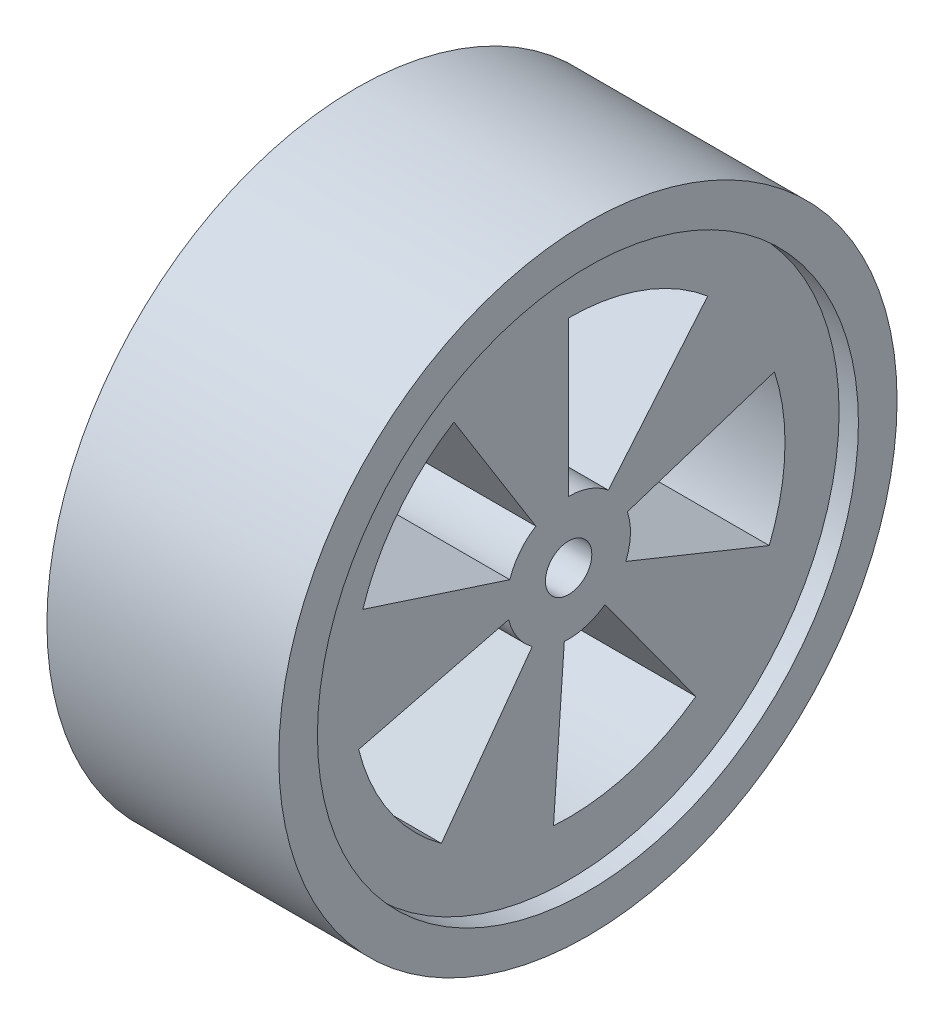
ISO-10303-21;
HEADER;
FILE_DESCRIPTION(('STEP AP214'),'2;1');
FILE_NAME('part.step','',(''),(''),'','','');
FILE_SCHEMA(('AUTOMOTIVE_DESIGN { 1 0 10303 214 1 1 1 1 }'));
ENDSEC;
DATA;
#1=APPLICATION_CONTEXT('core data for automotive mechanical design processes');
#2=APPLICATION_PROTOCOL_DEFINITION('international standard','automotive_design',2000,#1);
#3=PRODUCT_CONTEXT('',#1,'mechanical');
#4=PRODUCT('Part','Part','',(#3));
#5=PRODUCT_RELATED_PRODUCT_CATEGORY('part','',(#4));
#6=PRODUCT_DEFINITION_FORMATION('','',#4);
#7=PRODUCT_DEFINITION_CONTEXT('part definition',#1,'design');
#8=PRODUCT_DEFINITION('design','',#6,#7);
#9=PRODUCT_DEFINITION_SHAPE('','',#8);
#10=(LENGTH_UNIT() NAMED_UNIT(*) SI_UNIT(.MILLI.,.METRE.));
#11=(NAMED_UNIT(*) PLANE_ANGLE_UNIT() SI_UNIT($,.RADIAN.));
#12=(NAMED_UNIT(*) SI_UNIT($,.STERADIAN.) SOLID_ANGLE_UNIT());
#13=UNCERTAINTY_MEASURE_WITH_UNIT(LENGTH_MEASURE(1.E-05),#10,'distance_accuracy_value','');
#14=(GEOMETRIC_REPRESENTATION_CONTEXT(3) GLOBAL_UNCERTAINTY_ASSIGNED_CONTEXT((#13)) GLOBAL_UNIT_ASSIGNED_CONTEXT((#10,
#11,#12)) REPRESENTATION_CONTEXT('',''));
#15=CARTESIAN_POINT('',(0.,0.,0.));
#16=DIRECTION('',(0.,0.,1.));
#17=DIRECTION('',(1.,0.,0.));
#18=AXIS2_PLACEMENT_3D('',#15,#16,#17);
#19=CARTESIAN_POINT('',(12.5,0.,0.));
#20=DIRECTION('',(1.,0.,0.));
#21=DIRECTION('',(0.,0.,-1.));
#22=AXIS2_PLACEMENT_3D('',#19,#20,#21);
#23=PLANE('',#22);
#24=CARTESIAN_POINT('',(12.5,0.,0.));
#25=DIRECTION('',(1.,0.,0.));
#26=DIRECTION('',(0.,0.,-1.));
#27=AXIS2_PLACEMENT_3D('',#24,#25,#26);
#28=CIRCLE('',#27,35.);
#29=CARTESIAN_POINT('',(12.5,0.,-35.));
#30=VERTEX_POINT('',#29);
#31=EDGE_CURVE('E210',#30,#30,#28,.F.);
#32=ORIENTED_EDGE('',*,*,#31,.F.);
#33=EDGE_LOOP('',(#32));
#34=FACE_BOUND('',#33,.T.);
#35=CARTESIAN_POINT('',(12.5,0.,0.));
#36=DIRECTION('',(1.,0.,0.));
#37=DIRECTION('',(0.,0.,-1.));
#38=AXIS2_PLACEMENT_3D('',#35,#36,#37);
#39=CIRCLE('',#38,3.);
#40=CARTESIAN_POINT('',(12.5,0.,-3.));
#41=VERTEX_POINT('',#40);
#42=EDGE_CURVE('E53',#41,#41,#39,.T.);
#43=ORIENTED_EDGE('',*,*,#42,.F.);
#44=EDGE_LOOP('',(#43));
#45=FACE_BOUND('',#44,.T.);
#46=DIRECTION('',(0.,-1.,0.));
#47=VECTOR('',#46,1.);
#48=CARTESIAN_POINT('',(12.5,28.,0.));
#49=LINE('',#48,#47);
#50=CARTESIAN_POINT('',(12.5,28.,0.));
#51=VERTEX_POINT('',#50);
#52=CARTESIAN_POINT('',(12.5,8.,0.));
#53=VERTEX_POINT('',#52);
#54=EDGE_CURVE('E315',#51,#53,#49,.T.);
#55=ORIENTED_EDGE('',*,*,#54,.F.);
#56=CARTESIAN_POINT('',(12.5,0.,0.));
#57=DIRECTION('',(1.,0.,0.));
#58=DIRECTION('',(0.,0.,-1.));
#59=AXIS2_PLACEMENT_3D('',#56,#57,#58);
#60=CIRCLE('',#59,28.);
#61=CARTESIAN_POINT('',(12.5,21.4492444073315,-17.998053071223));
#62=VERTEX_POINT('',#61);
#63=EDGE_CURVE('E313',#62,#51,#60,.T.);
#64=ORIENTED_EDGE('',*,*,#63,.F.);
#65=DIRECTION('',(0.,0.766044443118982,-0.642787609686535));
#66=VECTOR('',#65,1.);
#67=CARTESIAN_POINT('',(12.5,6.12835554495186,-5.14230087749228));
#68=LINE('',#67,#66);
#69=CARTESIAN_POINT('',(12.5,6.12835554495186,-5.14230087749228));
#70=VERTEX_POINT('',#69);
#71=EDGE_CURVE('E321',#70,#62,#68,.T.);
#72=ORIENTED_EDGE('',*,*,#71,.F.);
#73=CARTESIAN_POINT('',(12.5,0.,0.));
#74=DIRECTION('',(-1.,0.,0.));
#75=DIRECTION('',(0.,0.,-1.));
#76=AXIS2_PLACEMENT_3D('',#73,#74,#75);
#77=CIRCLE('',#76,8.);
#78=EDGE_CURVE('E318',#53,#70,#77,.T.);
#79=ORIENTED_EDGE('',*,*,#78,.F.);
#80=EDGE_LOOP('',(#55,#64,#72,#79));
#81=FACE_BOUND('',#80,.T.);
#82=DIRECTION('',(0.,-0.309016994374945,0.951056516295154));
#83=VECTOR('',#82,1.);
#84=CARTESIAN_POINT('',(12.5,8.65247584249845,-26.6295824562643));
#85=LINE('',#84,#83);
#86=CARTESIAN_POINT('',(12.5,8.65247584249845,-26.6295824562643));
#87=VERTEX_POINT('',#86);
#88=CARTESIAN_POINT('',(12.5,2.47213595499956,-7.60845213036124));
#89=VERTEX_POINT('',#88);
#90=EDGE_CURVE('E284',#87,#89,#85,.T.);
#91=ORIENTED_EDGE('',*,*,#90,.F.);
#92=CARTESIAN_POINT('',(12.5,0.,0.));
#93=DIRECTION('',(1.,0.,0.));
#94=DIRECTION('',(0.,0.,-1.));
#95=AXIS2_PLACEMENT_3D('',#92,#93,#94);
#96=CIRCLE('',#95,28.);
#97=CARTESIAN_POINT('',(12.5,-10.4889846156455,-25.9611479278701));
#98=VERTEX_POINT('',#97);
#99=EDGE_CURVE('E282',#98,#87,#96,.T.);
#100=ORIENTED_EDGE('',*,*,#99,.F.);
#101=DIRECTION('',(0.,-0.374606593415909,-0.927183854566789));
#102=VECTOR('',#101,1.);
#103=CARTESIAN_POINT('',(12.5,-2.99685274732727,-7.41747083653431));
#104=LINE('',#103,#102);
#105=CARTESIAN_POINT('',(12.5,-2.99685274732727,-7.41747083653431));
#106=VERTEX_POINT('',#105);
#107=EDGE_CURVE('E290',#106,#98,#104,.T.);
#108=ORIENTED_EDGE('',*,*,#107,.F.);
#109=CARTESIAN_POINT('',(12.5,0.,0.));
#110=DIRECTION('',(-1.,0.,0.));
#111=DIRECTION('',(0.,0.,-1.));
#112=AXIS2_PLACEMENT_3D('',#109,#110,#111);
#113=CIRCLE('',#112,8.);
#114=EDGE_CURVE('E287',#89,#106,#113,.T.);
#115=ORIENTED_EDGE('',*,*,#114,.F.);
#116=EDGE_LOOP('',(#91,#100,#108,#115));
#117=FACE_BOUND('',#116,.T.);
#118=DIRECTION('',(0.,0.809016994374951,0.587785252292469));
#119=VECTOR('',#118,1.);
#120=CARTESIAN_POINT('',(12.5,-22.6524758424986,-16.4579870641891));
#121=LINE('',#120,#119);
#122=CARTESIAN_POINT('',(12.5,-22.6524758424986,-16.4579870641891));
#123=VERTEX_POINT('',#122);
#124=CARTESIAN_POINT('',(12.5,-6.47213595499961,-4.70228201833975));
#125=VERTEX_POINT('',#124);
#126=EDGE_CURVE('E253',#123,#125,#121,.T.);
#127=ORIENTED_EDGE('',*,*,#126,.F.);
#128=CARTESIAN_POINT('',(12.5,0.,0.));
#129=DIRECTION('',(1.,0.,0.));
#130=DIRECTION('',(0.,0.,-1.));
#131=AXIS2_PLACEMENT_3D('',#128,#129,#130);
#132=CIRCLE('',#131,28.);
#133=CARTESIAN_POINT('',(12.5,-27.9317934072751,1.9531812648355));
#134=VERTEX_POINT('',#133);
#135=EDGE_CURVE('E251',#134,#123,#132,.T.);
#136=ORIENTED_EDGE('',*,*,#135,.F.);
#137=DIRECTION('',(0.,-0.997564050259824,0.0697564737441249));
#138=VECTOR('',#137,1.);
#139=CARTESIAN_POINT('',(12.5,-7.9805124020786,0.558051789952999));
#140=LINE('',#139,#138);
#141=CARTESIAN_POINT('',(12.5,-7.9805124020786,0.558051789952999));
#142=VERTEX_POINT('',#141);
#143=EDGE_CURVE('E259',#142,#134,#140,.T.);
#144=ORIENTED_EDGE('',*,*,#143,.F.);
#145=CARTESIAN_POINT('',(12.5,0.,0.));
#146=DIRECTION('',(-1.,0.,0.));
#147=DIRECTION('',(0.,0.,-1.));
#148=AXIS2_PLACEMENT_3D('',#145,#146,#147);
#149=CIRCLE('',#148,8.);
#150=EDGE_CURVE('E256',#125,#142,#149,.T.);
#151=ORIENTED_EDGE('',*,*,#150,.F.);
#152=EDGE_LOOP('',(#127,#136,#144,#151));
#153=FACE_BOUND('',#152,.T.);
#154=DIRECTION('',(0.,0.809016994374942,-0.58778525229248));
#155=VECTOR('',#154,1.);
#156=CARTESIAN_POINT('',(12.5,-22.6524758424984,16.4579870641894));
#157=LINE('',#156,#155);
#158=CARTESIAN_POINT('',(12.5,-22.6524758424984,16.4579870641894));
#159=VERTEX_POINT('',#158);
#160=CARTESIAN_POINT('',(12.5,-6.47213595499954,4.70228201833984));
#161=VERTEX_POINT('',#160);
#162=EDGE_CURVE('E222',#159,#161,#157,.T.);
#163=ORIENTED_EDGE('',*,*,#162,.F.);
#164=CARTESIAN_POINT('',(12.5,0.,0.));
#165=DIRECTION('',(1.,0.,0.));
#166=DIRECTION('',(0.,0.,-1.));
#167=AXIS2_PLACEMENT_3D('',#164,#165,#166);
#168=CIRCLE('',#167,28.);
#169=CARTESIAN_POINT('',(12.5,-6.77381307679062,27.1682803357279));
#170=VERTEX_POINT('',#169);
#171=EDGE_CURVE('E220',#170,#159,#168,.T.);
#172=ORIENTED_EDGE('',*,*,#171,.F.);
#173=DIRECTION('',(0.,-0.241921895599665,0.970295726275997));
#174=VECTOR('',#173,1.);
#175=CARTESIAN_POINT('',(12.5,-1.93537516479732,7.76236581020798));
#176=LINE('',#175,#174);
#177=CARTESIAN_POINT('',(12.5,-1.93537516479732,7.76236581020798));
#178=VERTEX_POINT('',#177);
#179=EDGE_CURVE('E228',#178,#170,#176,.T.);
#180=ORIENTED_EDGE('',*,*,#179,.F.);
#181=CARTESIAN_POINT('',(12.5,0.,0.));
#182=DIRECTION('',(-1.,0.,0.));
#183=DIRECTION('',(0.,0.,-1.));
#184=AXIS2_PLACEMENT_3D('',#181,#182,#183);
#185=CIRCLE('',#184,8.);
#186=EDGE_CURVE('E225',#161,#178,#185,.T.);
#187=ORIENTED_EDGE('',*,*,#186,.F.);
#188=EDGE_LOOP('',(#163,#172,#180,#187));
#189=FACE_BOUND('',#188,.T.);
#190=DIRECTION('',(0.,-0.309016994374958,-0.95105651629515));
#191=VECTOR('',#190,1.);
#192=CARTESIAN_POINT('',(12.5,8.65247584249883,26.6295824562642));
#193=LINE('',#192,#191);
#194=CARTESIAN_POINT('',(12.5,8.65247584249883,26.6295824562642));
#195=VERTEX_POINT('',#194);
#196=CARTESIAN_POINT('',(12.5,2.47213595499967,7.6084521303612));
#197=VERTEX_POINT('',#196);
#198=EDGE_CURVE('E190',#195,#197,#193,.T.);
#199=ORIENTED_EDGE('',*,*,#198,.F.);
#200=CARTESIAN_POINT('',(12.5,0.,0.));
#201=DIRECTION('',(1.,0.,0.));
#202=DIRECTION('',(0.,0.,-1.));
#203=AXIS2_PLACEMENT_3D('',#200,#201,#202);
#204=CIRCLE('',#203,28.);
#205=CARTESIAN_POINT('',(12.5,23.74534669238,14.8377393985296));
#206=VERTEX_POINT('',#205);
#207=EDGE_CURVE('E182',#206,#195,#204,.T.);
#208=ORIENTED_EDGE('',*,*,#207,.F.);
#209=DIRECTION('',(0.,0.848048096156429,0.5299192642332));
#210=VECTOR('',#209,1.);
#211=CARTESIAN_POINT('',(12.5,6.78438476925143,4.23935411386561));
#212=LINE('',#211,#210);
#213=CARTESIAN_POINT('',(12.5,6.78438476925143,4.2393541138656));
#214=VERTEX_POINT('',#213);
#215=EDGE_CURVE('E204',#214,#206,#212,.T.);
#216=ORIENTED_EDGE('',*,*,#215,.F.);
#217=CARTESIAN_POINT('',(12.5,0.,0.));
#218=DIRECTION('',(-1.,0.,0.));
#219=DIRECTION('',(0.,0.,-1.));
#220=AXIS2_PLACEMENT_3D('',#217,#218,#219);
#221=CIRCLE('',#220,8.);
#222=EDGE_CURVE('E202',#197,#214,#221,.T.);
#223=ORIENTED_EDGE('',*,*,#222,.F.);
#224=EDGE_LOOP('',(#199,#208,#216,#223));
#225=FACE_BOUND('',#224,.T.);
#226=ADVANCED_FACE('F45',(#34,#45,#81,#117,#153,#189,#225),#23,.T.);
#227=CARTESIAN_POINT('',(-12.5,0.,0.));
#228=DIRECTION('',(1.,0.,0.));
#229=DIRECTION('',(0.,0.,-1.));
#230=AXIS2_PLACEMENT_3D('',#227,#228,#229);
#231=PLANE('',#230);
#232=CARTESIAN_POINT('',(-12.5,0.,0.));
#233=DIRECTION('',(1.,0.,0.));
#234=DIRECTION('',(0.,0.,-1.));
#235=AXIS2_PLACEMENT_3D('',#232,#233,#234);
#236=CIRCLE('',#235,28.);
#237=CARTESIAN_POINT('',(-12.5,-6.77381307679062,27.1682803357279));
#238=VERTEX_POINT('',#237);
#239=CARTESIAN_POINT('',(-12.5,-22.6524758424984,16.4579870641894));
#240=VERTEX_POINT('',#239);
#241=EDGE_CURVE('E198',#238,#240,#236,.T.);
#242=ORIENTED_EDGE('',*,*,#241,.T.);
#243=DIRECTION('',(0.,0.809016994374942,-0.58778525229248));
#244=VECTOR('',#243,1.);
#245=CARTESIAN_POINT('',(-12.5,-22.6524758424984,16.4579870641894));
#246=LINE('',#245,#244);
#247=CARTESIAN_POINT('',(-12.5,-6.47213595499954,4.70228201833984));
#248=VERTEX_POINT('',#247);
#249=EDGE_CURVE('E233',#240,#248,#246,.T.);
#250=ORIENTED_EDGE('',*,*,#249,.T.);
#251=CARTESIAN_POINT('',(-12.5,0.,0.));
#252=DIRECTION('',(-1.,0.,0.));
#253=DIRECTION('',(0.,0.,-1.));
#254=AXIS2_PLACEMENT_3D('',#251,#252,#253);
#255=CIRCLE('',#254,8.);
#256=CARTESIAN_POINT('',(-12.5,-1.93537516479732,7.76236581020798));
#257=VERTEX_POINT('',#256);
#258=EDGE_CURVE('E236',#248,#257,#255,.T.);
#259=ORIENTED_EDGE('',*,*,#258,.T.);
#260=DIRECTION('',(0.,-0.241921895599665,0.970295726275997));
#261=VECTOR('',#260,1.);
#262=CARTESIAN_POINT('',(-12.5,-1.93537516479732,7.76236581020798));
#263=LINE('',#262,#261);
#264=EDGE_CURVE('E223',#257,#238,#263,.T.);
#265=ORIENTED_EDGE('',*,*,#264,.T.);
#266=EDGE_LOOP('',(#242,#250,#259,#265));
#267=FACE_BOUND('',#266,.T.);
#268=CARTESIAN_POINT('',(-12.5,0.,0.));
#269=DIRECTION('',(1.,0.,0.));
#270=DIRECTION('',(0.,0.,-1.));
#271=AXIS2_PLACEMENT_3D('',#268,#269,#270);
#272=CIRCLE('',#271,28.);
#273=CARTESIAN_POINT('',(-12.5,-10.4889846156455,-25.9611479278701));
#274=VERTEX_POINT('',#273);
#275=CARTESIAN_POINT('',(-12.5,8.65247584249845,-26.6295824562643));
#276=VERTEX_POINT('',#275);
#277=EDGE_CURVE('E281',#274,#276,#272,.T.);
#278=ORIENTED_EDGE('',*,*,#277,.T.);
#279=DIRECTION('',(0.,-0.309016994374945,0.951056516295154));
#280=VECTOR('',#279,1.);
#281=CARTESIAN_POINT('',(-12.5,8.65247584249845,-26.6295824562643));
#282=LINE('',#281,#280);
#283=CARTESIAN_POINT('',(-12.5,2.47213595499956,-7.60845213036124));
#284=VERTEX_POINT('',#283);
#285=EDGE_CURVE('E295',#276,#284,#282,.T.);
#286=ORIENTED_EDGE('',*,*,#285,.T.);
#287=CARTESIAN_POINT('',(-12.5,0.,0.));
#288=DIRECTION('',(-1.,0.,0.));
#289=DIRECTION('',(0.,0.,-1.));
#290=AXIS2_PLACEMENT_3D('',#287,#288,#289);
#291=CIRCLE('',#290,8.);
#292=CARTESIAN_POINT('',(-12.5,-2.99685274732727,-7.41747083653431));
#293=VERTEX_POINT('',#292);
#294=EDGE_CURVE('E298',#284,#293,#291,.T.);
#295=ORIENTED_EDGE('',*,*,#294,.T.);
#296=DIRECTION('',(0.,-0.374606593415909,-0.927183854566789));
#297=VECTOR('',#296,1.);
#298=CARTESIAN_POINT('',(-12.5,-2.99685274732727,-7.41747083653431));
#299=LINE('',#298,#297);
#300=EDGE_CURVE('E285',#293,#274,#299,.T.);
#301=ORIENTED_EDGE('',*,*,#300,.T.);
#302=EDGE_LOOP('',(#278,#286,#295,#301));
#303=FACE_BOUND('',#302,.T.);
#304=CARTESIAN_POINT('',(-12.5,0.,0.));
#305=DIRECTION('',(1.,0.,0.));
#306=DIRECTION('',(0.,0.,-1.));
#307=AXIS2_PLACEMENT_3D('',#304,#305,#306);
#308=CIRCLE('',#307,3.);
#309=CARTESIAN_POINT('',(-12.5,0.,-3.));
#310=VERTEX_POINT('',#309);
#311=EDGE_CURVE('E343',#310,#310,#308,.T.);
#312=ORIENTED_EDGE('',*,*,#311,.T.);
#313=EDGE_LOOP('',(#312));
#314=FACE_BOUND('',#313,.T.);
#315=CARTESIAN_POINT('',(-12.5,0.,0.));
#316=DIRECTION('',(1.,0.,0.));
#317=DIRECTION('',(0.,0.,-1.));
#318=AXIS2_PLACEMENT_3D('',#315,#316,#317);
#319=CIRCLE('',#318,35.);
#320=CARTESIAN_POINT('',(-12.5,0.,-35.));
#321=VERTEX_POINT('',#320);
#322=EDGE_CURVE('E11',#321,#321,#319,.T.);
#323=ORIENTED_EDGE('',*,*,#322,.F.);
#324=EDGE_LOOP('',(#323));
#325=FACE_BOUND('',#324,.T.);
#326=CARTESIAN_POINT('',(-12.5,0.,0.));
#327=DIRECTION('',(1.,0.,0.));
#328=DIRECTION('',(0.,0.,-1.));
#329=AXIS2_PLACEMENT_3D('',#326,#327,#328);
#330=CIRCLE('',#329,28.);
#331=CARTESIAN_POINT('',(-12.5,21.4492444073315,-17.998053071223));
#332=VERTEX_POINT('',#331);
#333=CARTESIAN_POINT('',(-12.5,28.,0.));
#334=VERTEX_POINT('',#333);
#335=EDGE_CURVE('E312',#332,#334,#330,.T.);
#336=ORIENTED_EDGE('',*,*,#335,.T.);
#337=DIRECTION('',(0.,-1.,0.));
#338=VECTOR('',#337,1.);
#339=CARTESIAN_POINT('',(-12.5,28.,0.));
#340=LINE('',#339,#338);
#341=CARTESIAN_POINT('',(-12.5,8.,0.));
#342=VERTEX_POINT('',#341);
#343=EDGE_CURVE('E326',#334,#342,#340,.T.);
#344=ORIENTED_EDGE('',*,*,#343,.T.);
#345=CARTESIAN_POINT('',(-12.5,0.,0.));
#346=DIRECTION('',(-1.,0.,0.));
#347=DIRECTION('',(0.,0.,-1.));
#348=AXIS2_PLACEMENT_3D('',#345,#346,#347);
#349=CIRCLE('',#348,8.);
#350=CARTESIAN_POINT('',(-12.5,6.12835554495186,-5.14230087749228));
#351=VERTEX_POINT('',#350);
#352=EDGE_CURVE('E329',#342,#351,#349,.T.);
#353=ORIENTED_EDGE('',*,*,#352,.T.);
#354=DIRECTION('',(0.,0.766044443118982,-0.642787609686535));
#355=VECTOR('',#354,1.);
#356=CARTESIAN_POINT('',(-12.5,6.12835554495186,-5.14230087749228));
#357=LINE('',#356,#355);
#358=EDGE_CURVE('E316',#351,#332,#357,.T.);
#359=ORIENTED_EDGE('',*,*,#358,.T.);
#360=EDGE_LOOP('',(#336,#344,#353,#359));
#361=FACE_BOUND('',#360,.T.);
#362=CARTESIAN_POINT('',(-12.5,0.,0.));
#363=DIRECTION('',(1.,0.,0.));
#364=DIRECTION('',(0.,0.,-1.));
#365=AXIS2_PLACEMENT_3D('',#362,#363,#364);
#366=CIRCLE('',#365,28.);
#367=CARTESIAN_POINT('',(-12.5,-27.9317934072751,1.9531812648355));
#368=VERTEX_POINT('',#367);
#369=CARTESIAN_POINT('',(-12.5,-22.6524758424986,-16.4579870641891));
#370=VERTEX_POINT('',#369);
#371=EDGE_CURVE('E250',#368,#370,#366,.T.);
#372=ORIENTED_EDGE('',*,*,#371,.T.);
#373=DIRECTION('',(0.,0.809016994374951,0.587785252292469));
#374=VECTOR('',#373,1.);
#375=CARTESIAN_POINT('',(-12.5,-22.6524758424986,-16.4579870641891));
#376=LINE('',#375,#374);
#377=CARTESIAN_POINT('',(-12.5,-6.47213595499961,-4.70228201833975));
#378=VERTEX_POINT('',#377);
#379=EDGE_CURVE('E264',#370,#378,#376,.T.);
#380=ORIENTED_EDGE('',*,*,#379,.T.);
#381=CARTESIAN_POINT('',(-12.5,0.,0.));
#382=DIRECTION('',(-1.,0.,0.));
#383=DIRECTION('',(0.,0.,-1.));
#384=AXIS2_PLACEMENT_3D('',#381,#382,#383);
#385=CIRCLE('',#384,8.);
#386=CARTESIAN_POINT('',(-12.5,-7.9805124020786,0.558051789952998));
#387=VERTEX_POINT('',#386);
#388=EDGE_CURVE('E267',#378,#387,#385,.T.);
#389=ORIENTED_EDGE('',*,*,#388,.T.);
#390=DIRECTION('',(0.,-0.997564050259824,0.0697564737441249));
#391=VECTOR('',#390,1.);
#392=CARTESIAN_POINT('',(-12.5,-7.9805124020786,0.558051789952999));
#393=LINE('',#392,#391);
#394=EDGE_CURVE('E254',#387,#368,#393,.T.);
#395=ORIENTED_EDGE('',*,*,#394,.T.);
#396=EDGE_LOOP('',(#372,#380,#389,#395));
#397=FACE_BOUND('',#396,.T.);
#398=CARTESIAN_POINT('',(-12.5,0.,0.));
#399=DIRECTION('',(1.,0.,0.));
#400=DIRECTION('',(0.,0.,-1.));
#401=AXIS2_PLACEMENT_3D('',#398,#399,#400);
#402=CIRCLE('',#401,28.);
#403=CARTESIAN_POINT('',(-12.5,23.74534669238,14.8377393985296));
#404=VERTEX_POINT('',#403);
#405=CARTESIAN_POINT('',(-12.5,8.65247584249883,26.6295824562642));
#406=VERTEX_POINT('',#405);
#407=EDGE_CURVE('E68',#404,#406,#402,.T.);
#408=ORIENTED_EDGE('',*,*,#407,.T.);
#409=DIRECTION('',(0.,-0.309016994374958,-0.95105651629515));
#410=VECTOR('',#409,1.);
#411=CARTESIAN_POINT('',(-12.5,8.65247584249883,26.6295824562642));
#412=LINE('',#411,#410);
#413=CARTESIAN_POINT('',(-12.5,2.47213595499967,7.6084521303612));
#414=VERTEX_POINT('',#413);
#415=EDGE_CURVE('E197',#406,#414,#412,.T.);
#416=ORIENTED_EDGE('',*,*,#415,.T.);
#417=CARTESIAN_POINT('',(-12.5,0.,0.));
#418=DIRECTION('',(-1.,0.,0.));
#419=DIRECTION('',(0.,0.,-1.));
#420=AXIS2_PLACEMENT_3D('',#417,#418,#419);
#421=CIRCLE('',#420,8.);
#422=CARTESIAN_POINT('',(-12.5,6.78438476925143,4.23935411386561));
#423=VERTEX_POINT('',#422);
#424=EDGE_CURVE('E212',#414,#423,#421,.T.);
#425=ORIENTED_EDGE('',*,*,#424,.T.);
#426=DIRECTION('',(0.,0.848048096156429,0.5299192642332));
#427=VECTOR('',#426,1.);
#428=CARTESIAN_POINT('',(-12.5,6.78438476925143,4.23935411386561));
#429=LINE('',#428,#427);
#430=EDGE_CURVE('E191',#423,#404,#429,.T.);
#431=ORIENTED_EDGE('',*,*,#430,.T.);
#432=EDGE_LOOP('',(#408,#416,#425,#431));
#433=FACE_BOUND('',#432,.T.);
#434=ADVANCED_FACE('F47',(#267,#303,#314,#325,#361,#397,#433),#231,.F.);
#435=CARTESIAN_POINT('',(12.5,0.,0.));
#436=DIRECTION('',(-1.,0.,0.));
#437=DIRECTION('',(0.,0.,1.));
#438=AXIS2_PLACEMENT_3D('',#435,#436,#437);
#439=CYLINDRICAL_SURFACE('',#438,3.);
#440=ORIENTED_EDGE('',*,*,#42,.T.);
#441=EDGE_LOOP('',(#440));
#442=FACE_BOUND('',#441,.T.);
#443=ORIENTED_EDGE('',*,*,#311,.F.);
#444=EDGE_LOOP('',(#443));
#445=FACE_BOUND('',#444,.T.);
#446=ADVANCED_FACE('F350',(#442,#445),#439,.F.);
#447=CARTESIAN_POINT('',(12.5,0.,0.));
#448=DIRECTION('',(-1.,0.,0.));
#449=DIRECTION('',(0.,0.,1.));
#450=AXIS2_PLACEMENT_3D('',#447,#448,#449);
#451=CYLINDRICAL_SURFACE('',#450,28.);
#452=ORIENTED_EDGE('',*,*,#335,.F.);
#453=DIRECTION('',(-1.,0.,0.));
#454=VECTOR('',#453,1.);
#455=CARTESIAN_POINT('',(12.5,21.4492444073315,-17.998053071223));
#456=LINE('',#455,#454);
#457=EDGE_CURVE('E323',#62,#332,#456,.T.);
#458=ORIENTED_EDGE('',*,*,#457,.F.);
#459=ORIENTED_EDGE('',*,*,#63,.T.);
#460=DIRECTION('',(-1.,0.,0.));
#461=VECTOR('',#460,1.);
#462=CARTESIAN_POINT('',(12.5,28.,0.));
#463=LINE('',#462,#461);
#464=EDGE_CURVE('E340',#51,#334,#463,.T.);
#465=ORIENTED_EDGE('',*,*,#464,.T.);
#466=EDGE_LOOP('',(#452,#458,#459,#465));
#467=FACE_BOUND('',#466,.T.);
#468=ADVANCED_FACE('F352',(#467),#451,.F.);
#469=CARTESIAN_POINT('',(12.5,28.,0.));
#470=DIRECTION('',(0.,0.,-1.));
#471=DIRECTION('',(0.,1.,0.));
#472=AXIS2_PLACEMENT_3D('',#469,#470,#471);
#473=PLANE('',#472);
#474=ORIENTED_EDGE('',*,*,#343,.F.);
#475=ORIENTED_EDGE('',*,*,#464,.F.);
#476=ORIENTED_EDGE('',*,*,#54,.T.);
#477=DIRECTION('',(-1.,0.,0.));
#478=VECTOR('',#477,1.);
#479=CARTESIAN_POINT('',(12.5,8.,0.));
#480=LINE('',#479,#478);
#481=EDGE_CURVE('E338',#53,#342,#480,.T.);
#482=ORIENTED_EDGE('',*,*,#481,.T.);
#483=EDGE_LOOP('',(#474,#475,#476,#482));
#484=FACE_BOUND('',#483,.T.);
#485=ADVANCED_FACE('F359',(#484),#473,.T.);
#486=CARTESIAN_POINT('',(12.5,0.,0.));
#487=DIRECTION('',(-1.,0.,0.));
#488=DIRECTION('',(0.,0.,1.));
#489=AXIS2_PLACEMENT_3D('',#486,#487,#488);
#490=CYLINDRICAL_SURFACE('',#489,8.);
#491=ORIENTED_EDGE('',*,*,#352,.F.);
#492=ORIENTED_EDGE('',*,*,#481,.F.);
#493=ORIENTED_EDGE('',*,*,#78,.T.);
#494=DIRECTION('',(-1.,0.,0.));
#495=VECTOR('',#494,1.);
#496=CARTESIAN_POINT('',(12.5,6.12835554495186,-5.14230087749228));
#497=LINE('',#496,#495);
#498=EDGE_CURVE('E336',#70,#351,#497,.T.);
#499=ORIENTED_EDGE('',*,*,#498,.T.);
#500=EDGE_LOOP('',(#491,#492,#493,#499));
#501=FACE_BOUND('',#500,.T.);
#502=ADVANCED_FACE('F451',(#501),#490,.T.);
#503=CARTESIAN_POINT('',(12.5,6.12835554495186,-5.14230087749228));
#504=DIRECTION('',(0.,0.642787609686535,0.766044443118982));
#505=DIRECTION('',(0.,-0.766044443118982,0.642787609686535));
#506=AXIS2_PLACEMENT_3D('',#503,#504,#505);
#507=PLANE('',#506);
#508=ORIENTED_EDGE('',*,*,#358,.F.);
#509=ORIENTED_EDGE('',*,*,#498,.F.);
#510=ORIENTED_EDGE('',*,*,#71,.T.);
#511=ORIENTED_EDGE('',*,*,#457,.T.);
#512=EDGE_LOOP('',(#508,#509,#510,#511));
#513=FACE_BOUND('',#512,.T.);
#514=ADVANCED_FACE('F447',(#513),#507,.T.);
#515=CARTESIAN_POINT('',(12.5,0.,0.));
#516=DIRECTION('',(-1.,0.,0.));
#517=DIRECTION('',(0.,0.,1.));
#518=AXIS2_PLACEMENT_3D('',#515,#516,#517);
#519=CYLINDRICAL_SURFACE('',#518,28.);
#520=ORIENTED_EDGE('',*,*,#277,.F.);
#521=DIRECTION('',(-1.,0.,0.));
#522=VECTOR('',#521,1.);
#523=CARTESIAN_POINT('',(12.5,-10.4889846156455,-25.9611479278701));
#524=LINE('',#523,#522);
#525=EDGE_CURVE('E292',#98,#274,#524,.T.);
#526=ORIENTED_EDGE('',*,*,#525,.F.);
#527=ORIENTED_EDGE('',*,*,#99,.T.);
#528=DIRECTION('',(-1.,0.,0.));
#529=VECTOR('',#528,1.);
#530=CARTESIAN_POINT('',(12.5,8.65247584249845,-26.6295824562643));
#531=LINE('',#530,#529);
#532=EDGE_CURVE('E309',#87,#276,#531,.T.);
#533=ORIENTED_EDGE('',*,*,#532,.T.);
#534=EDGE_LOOP('',(#520,#526,#527,#533));
#535=FACE_BOUND('',#534,.T.);
#536=ADVANCED_FACE('F443',(#535),#519,.F.);
#537=CARTESIAN_POINT('',(12.5,8.65247584249845,-26.6295824562643));
#538=DIRECTION('',(0.,-0.951056516295154,-0.309016994374945));
#539=DIRECTION('',(0.,0.309016994374945,-0.951056516295154));
#540=AXIS2_PLACEMENT_3D('',#537,#538,#539);
#541=PLANE('',#540);
#542=ORIENTED_EDGE('',*,*,#285,.F.);
#543=ORIENTED_EDGE('',*,*,#532,.F.);
#544=ORIENTED_EDGE('',*,*,#90,.T.);
#545=DIRECTION('',(-1.,0.,0.));
#546=VECTOR('',#545,1.);
#547=CARTESIAN_POINT('',(12.5,2.47213595499956,-7.60845213036124));
#548=LINE('',#547,#546);
#549=EDGE_CURVE('E307',#89,#284,#548,.T.);
#550=ORIENTED_EDGE('',*,*,#549,.T.);
#551=EDGE_LOOP('',(#542,#543,#544,#550));
#552=FACE_BOUND('',#551,.T.);
#553=ADVANCED_FACE('F439',(#552),#541,.T.);
#554=CARTESIAN_POINT('',(12.5,0.,0.));
#555=DIRECTION('',(-1.,0.,0.));
#556=DIRECTION('',(0.,0.,1.));
#557=AXIS2_PLACEMENT_3D('',#554,#555,#556);
#558=CYLINDRICAL_SURFACE('',#557,8.);
#559=ORIENTED_EDGE('',*,*,#294,.F.);
#560=ORIENTED_EDGE('',*,*,#549,.F.);
#561=ORIENTED_EDGE('',*,*,#114,.T.);
#562=DIRECTION('',(-1.,0.,0.));
#563=VECTOR('',#562,1.);
#564=CARTESIAN_POINT('',(12.5,-2.99685274732727,-7.41747083653431));
#565=LINE('',#564,#563);
#566=EDGE_CURVE('E305',#106,#293,#565,.T.);
#567=ORIENTED_EDGE('',*,*,#566,.T.);
#568=EDGE_LOOP('',(#559,#560,#561,#567));
#569=FACE_BOUND('',#568,.T.);
#570=ADVANCED_FACE('F435',(#569),#558,.T.);
#571=CARTESIAN_POINT('',(12.5,-2.99685274732727,-7.41747083653431));
#572=DIRECTION('',(0.,0.927183854566789,-0.374606593415909));
#573=DIRECTION('',(0.,0.374606593415909,0.927183854566789));
#574=AXIS2_PLACEMENT_3D('',#571,#572,#573);
#575=PLANE('',#574);
#576=ORIENTED_EDGE('',*,*,#300,.F.);
#577=ORIENTED_EDGE('',*,*,#566,.F.);
#578=ORIENTED_EDGE('',*,*,#107,.T.);
#579=ORIENTED_EDGE('',*,*,#525,.T.);
#580=EDGE_LOOP('',(#576,#577,#578,#579));
#581=FACE_BOUND('',#580,.T.);
#582=ADVANCED_FACE('F431',(#581),#575,.T.);
#583=CARTESIAN_POINT('',(12.5,0.,0.));
#584=DIRECTION('',(-1.,0.,0.));
#585=DIRECTION('',(0.,0.,1.));
#586=AXIS2_PLACEMENT_3D('',#583,#584,#585);
#587=CYLINDRICAL_SURFACE('',#586,28.);
#588=ORIENTED_EDGE('',*,*,#371,.F.);
#589=DIRECTION('',(-1.,0.,0.));
#590=VECTOR('',#589,1.);
#591=CARTESIAN_POINT('',(12.5,-27.9317934072751,1.9531812648355));
#592=LINE('',#591,#590);
#593=EDGE_CURVE('E261',#134,#368,#592,.T.);
#594=ORIENTED_EDGE('',*,*,#593,.F.);
#595=ORIENTED_EDGE('',*,*,#135,.T.);
#596=DIRECTION('',(-1.,0.,0.));
#597=VECTOR('',#596,1.);
#598=CARTESIAN_POINT('',(12.5,-22.6524758424986,-16.4579870641891));
#599=LINE('',#598,#597);
#600=EDGE_CURVE('E278',#123,#370,#599,.T.);
#601=ORIENTED_EDGE('',*,*,#600,.T.);
#602=EDGE_LOOP('',(#588,#594,#595,#601));
#603=FACE_BOUND('',#602,.T.);
#604=ADVANCED_FACE('F427',(#603),#587,.F.);
#605=CARTESIAN_POINT('',(12.5,-22.6524758424986,-16.4579870641891));
#606=DIRECTION('',(0.,-0.587785252292469,0.809016994374951));
#607=DIRECTION('',(0.,-0.809016994374951,-0.587785252292469));
#608=AXIS2_PLACEMENT_3D('',#605,#606,#607);
#609=PLANE('',#608);
#610=ORIENTED_EDGE('',*,*,#379,.F.);
#611=ORIENTED_EDGE('',*,*,#600,.F.);
#612=ORIENTED_EDGE('',*,*,#126,.T.);
#613=DIRECTION('',(-1.,0.,0.));
#614=VECTOR('',#613,1.);
#615=CARTESIAN_POINT('',(12.5,-6.47213595499961,-4.70228201833975));
#616=LINE('',#615,#614);
#617=EDGE_CURVE('E276',#125,#378,#616,.T.);
#618=ORIENTED_EDGE('',*,*,#617,.T.);
#619=EDGE_LOOP('',(#610,#611,#612,#618));
#620=FACE_BOUND('',#619,.T.);
#621=ADVANCED_FACE('F423',(#620),#609,.T.);
#622=CARTESIAN_POINT('',(12.5,0.,0.));
#623=DIRECTION('',(-1.,0.,0.));
#624=DIRECTION('',(0.,0.,1.));
#625=AXIS2_PLACEMENT_3D('',#622,#623,#624);
#626=CYLINDRICAL_SURFACE('',#625,8.);
#627=ORIENTED_EDGE('',*,*,#388,.F.);
#628=ORIENTED_EDGE('',*,*,#617,.F.);
#629=ORIENTED_EDGE('',*,*,#150,.T.);
#630=DIRECTION('',(-1.,0.,0.));
#631=VECTOR('',#630,1.);
#632=CARTESIAN_POINT('',(12.5,-7.9805124020786,0.558051789952998));
#633=LINE('',#632,#631);
#634=EDGE_CURVE('E274',#142,#387,#633,.T.);
#635=ORIENTED_EDGE('',*,*,#634,.T.);
#636=EDGE_LOOP('',(#627,#628,#629,#635));
#637=FACE_BOUND('',#636,.T.);
#638=ADVANCED_FACE('F419',(#637),#626,.T.);
#639=CARTESIAN_POINT('',(12.5,-7.9805124020786,0.558051789952999));
#640=DIRECTION('',(0.,-0.0697564737441249,-0.997564050259824));
#641=DIRECTION('',(0.,0.997564050259824,-0.0697564737441249));
#642=AXIS2_PLACEMENT_3D('',#639,#640,#641);
#643=PLANE('',#642);
#644=ORIENTED_EDGE('',*,*,#394,.F.);
#645=ORIENTED_EDGE('',*,*,#634,.F.);
#646=ORIENTED_EDGE('',*,*,#143,.T.);
#647=ORIENTED_EDGE('',*,*,#593,.T.);
#648=EDGE_LOOP('',(#644,#645,#646,#647));
#649=FACE_BOUND('',#648,.T.);
#650=ADVANCED_FACE('F416',(#649),#643,.T.);
#651=CARTESIAN_POINT('',(12.5,0.,0.));
#652=DIRECTION('',(-1.,0.,0.));
#653=DIRECTION('',(0.,0.,1.));
#654=AXIS2_PLACEMENT_3D('',#651,#652,#653);
#655=CYLINDRICAL_SURFACE('',#654,28.);
#656=ORIENTED_EDGE('',*,*,#241,.F.);
#657=DIRECTION('',(-1.,0.,0.));
#658=VECTOR('',#657,1.);
#659=CARTESIAN_POINT('',(12.5,-6.77381307679062,27.1682803357279));
#660=LINE('',#659,#658);
#661=EDGE_CURVE('E230',#170,#238,#660,.T.);
#662=ORIENTED_EDGE('',*,*,#661,.F.);
#663=ORIENTED_EDGE('',*,*,#171,.T.);
#664=DIRECTION('',(-1.,0.,0.));
#665=VECTOR('',#664,1.);
#666=CARTESIAN_POINT('',(12.5,-22.6524758424984,16.4579870641894));
#667=LINE('',#666,#665);
#668=EDGE_CURVE('E247',#159,#240,#667,.T.);
#669=ORIENTED_EDGE('',*,*,#668,.T.);
#670=EDGE_LOOP('',(#656,#662,#663,#669));
#671=FACE_BOUND('',#670,.T.);
#672=ADVANCED_FACE('F398',(#671),#655,.F.);
#673=CARTESIAN_POINT('',(12.5,-22.6524758424984,16.4579870641894));
#674=DIRECTION('',(0.,0.58778525229248,0.809016994374942));
#675=DIRECTION('',(0.,-0.809016994374942,0.58778525229248));
#676=AXIS2_PLACEMENT_3D('',#673,#674,#675);
#677=PLANE('',#676);
#678=ORIENTED_EDGE('',*,*,#249,.F.);
#679=ORIENTED_EDGE('',*,*,#668,.F.);
#680=ORIENTED_EDGE('',*,*,#162,.T.);
#681=DIRECTION('',(-1.,0.,0.));
#682=VECTOR('',#681,1.);
#683=CARTESIAN_POINT('',(12.5,-6.47213595499954,4.70228201833984));
#684=LINE('',#683,#682);
#685=EDGE_CURVE('E245',#161,#248,#684,.T.);
#686=ORIENTED_EDGE('',*,*,#685,.T.);
#687=EDGE_LOOP('',(#678,#679,#680,#686));
#688=FACE_BOUND('',#687,.T.);
#689=ADVANCED_FACE('F391',(#688),#677,.T.);
#690=CARTESIAN_POINT('',(12.5,0.,0.));
#691=DIRECTION('',(-1.,0.,0.));
#692=DIRECTION('',(0.,0.,1.));
#693=AXIS2_PLACEMENT_3D('',#690,#691,#692);
#694=CYLINDRICAL_SURFACE('',#693,8.);
#695=ORIENTED_EDGE('',*,*,#258,.F.);
#696=ORIENTED_EDGE('',*,*,#685,.F.);
#697=ORIENTED_EDGE('',*,*,#186,.T.);
#698=DIRECTION('',(-1.,0.,0.));
#699=VECTOR('',#698,1.);
#700=CARTESIAN_POINT('',(12.5,-1.93537516479732,7.76236581020798));
#701=LINE('',#700,#699);
#702=EDGE_CURVE('E243',#178,#257,#701,.T.);
#703=ORIENTED_EDGE('',*,*,#702,.T.);
#704=EDGE_LOOP('',(#695,#696,#697,#703));
#705=FACE_BOUND('',#704,.T.);
#706=ADVANCED_FACE('F394',(#705),#694,.T.);
#707=CARTESIAN_POINT('',(12.5,-1.93537516479732,7.76236581020798));
#708=DIRECTION('',(0.,-0.970295726275997,-0.241921895599665));
#709=DIRECTION('',(0.,0.241921895599665,-0.970295726275997));
#710=AXIS2_PLACEMENT_3D('',#707,#708,#709);
#711=PLANE('',#710);
#712=ORIENTED_EDGE('',*,*,#264,.F.);
#713=ORIENTED_EDGE('',*,*,#702,.F.);
#714=ORIENTED_EDGE('',*,*,#179,.T.);
#715=ORIENTED_EDGE('',*,*,#661,.T.);
#716=EDGE_LOOP('',(#712,#713,#714,#715));
#717=FACE_BOUND('',#716,.T.);
#718=ADVANCED_FACE('F401',(#717),#711,.T.);
#719=CARTESIAN_POINT('',(12.5,0.,0.));
#720=DIRECTION('',(-1.,0.,0.));
#721=DIRECTION('',(0.,0.,1.));
#722=AXIS2_PLACEMENT_3D('',#719,#720,#721);
#723=CYLINDRICAL_SURFACE('',#722,28.);
#724=ORIENTED_EDGE('',*,*,#407,.F.);
#725=DIRECTION('',(-1.,0.,0.));
#726=VECTOR('',#725,1.);
#727=CARTESIAN_POINT('',(12.5,23.74534669238,14.8377393985296));
#728=LINE('',#727,#726);
#729=EDGE_CURVE('E186',#206,#404,#728,.T.);
#730=ORIENTED_EDGE('',*,*,#729,.F.);
#731=ORIENTED_EDGE('',*,*,#207,.T.);
#732=DIRECTION('',(-1.,0.,0.));
#733=VECTOR('',#732,1.);
#734=CARTESIAN_POINT('',(12.5,8.65247584249883,26.6295824562642));
#735=LINE('',#734,#733);
#736=EDGE_CURVE('E185',#195,#406,#735,.T.);
#737=ORIENTED_EDGE('',*,*,#736,.T.);
#738=EDGE_LOOP('',(#724,#730,#731,#737));
#739=FACE_BOUND('',#738,.T.);
#740=ADVANCED_FACE('F184',(#739),#723,.F.);
#741=CARTESIAN_POINT('',(12.5,8.65247584249883,26.6295824562642));
#742=DIRECTION('',(0.,0.95105651629515,-0.309016994374958));
#743=DIRECTION('',(0.,0.309016994374958,0.95105651629515));
#744=AXIS2_PLACEMENT_3D('',#741,#742,#743);
#745=PLANE('',#744);
#746=ORIENTED_EDGE('',*,*,#415,.F.);
#747=ORIENTED_EDGE('',*,*,#736,.F.);
#748=ORIENTED_EDGE('',*,*,#198,.T.);
#749=DIRECTION('',(-1.,0.,0.));
#750=VECTOR('',#749,1.);
#751=CARTESIAN_POINT('',(12.5,2.47213595499967,7.6084521303612));
#752=LINE('',#751,#750);
#753=EDGE_CURVE('E199',#197,#414,#752,.T.);
#754=ORIENTED_EDGE('',*,*,#753,.T.);
#755=EDGE_LOOP('',(#746,#747,#748,#754));
#756=FACE_BOUND('',#755,.T.);
#757=ADVANCED_FACE('F194',(#756),#745,.T.);
#758=CARTESIAN_POINT('',(12.5,0.,0.));
#759=DIRECTION('',(-1.,0.,0.));
#760=DIRECTION('',(0.,0.,1.));
#761=AXIS2_PLACEMENT_3D('',#758,#759,#760);
#762=CYLINDRICAL_SURFACE('',#761,8.);
#763=ORIENTED_EDGE('',*,*,#424,.F.);
#764=ORIENTED_EDGE('',*,*,#753,.F.);
#765=ORIENTED_EDGE('',*,*,#222,.T.);
#766=DIRECTION('',(-1.,0.,0.));
#767=VECTOR('',#766,1.);
#768=CARTESIAN_POINT('',(12.5,6.78438476925143,4.23935411386561));
#769=LINE('',#768,#767);
#770=EDGE_CURVE('E60',#214,#423,#769,.T.);
#771=ORIENTED_EDGE('',*,*,#770,.T.);
#772=EDGE_LOOP('',(#763,#764,#765,#771));
#773=FACE_BOUND('',#772,.T.);
#774=ADVANCED_FACE('F473',(#773),#762,.T.);
#775=CARTESIAN_POINT('',(12.5,6.78438476925143,4.23935411386561));
#776=DIRECTION('',(0.,-0.5299192642332,0.848048096156429));
#777=DIRECTION('',(0.,-0.848048096156429,-0.5299192642332));
#778=AXIS2_PLACEMENT_3D('',#775,#776,#777);
#779=PLANE('',#778);
#780=ORIENTED_EDGE('',*,*,#430,.F.);
#781=ORIENTED_EDGE('',*,*,#770,.F.);
#782=ORIENTED_EDGE('',*,*,#215,.T.);
#783=ORIENTED_EDGE('',*,*,#729,.T.);
#784=EDGE_LOOP('',(#780,#781,#782,#783));
#785=FACE_BOUND('',#784,.T.);
#786=ADVANCED_FACE('F470',(#785),#779,.T.);
#787=CARTESIAN_POINT('',(15.,0.,0.));
#788=DIRECTION('',(-1.,0.,0.));
#789=DIRECTION('',(0.,0.,1.));
#790=AXIS2_PLACEMENT_3D('',#787,#788,#789);
#791=CYLINDRICAL_SURFACE('',#790,35.);
#792=CARTESIAN_POINT('',(-15.,0.,0.));
#793=DIRECTION('',(1.,0.,0.));
#794=DIRECTION('',(0.,0.,-1.));
#795=AXIS2_PLACEMENT_3D('',#792,#793,#794);
#796=CIRCLE('',#795,35.);
#797=CARTESIAN_POINT('',(-15.,0.,-35.));
#798=VERTEX_POINT('',#797);
#799=EDGE_CURVE('E775',#798,#798,#796,.T.);
#800=ORIENTED_EDGE('',*,*,#799,.F.);
#801=EDGE_LOOP('',(#800));
#802=FACE_BOUND('',#801,.T.);
#803=ORIENTED_EDGE('',*,*,#322,.T.);
#804=EDGE_LOOP('',(#803));
#805=FACE_BOUND('',#804,.T.);
#806=ADVANCED_FACE('F472',(#802,#805),#791,.F.);
#807=CARTESIAN_POINT('',(15.,0.,0.));
#808=DIRECTION('',(1.,0.,0.));
#809=DIRECTION('',(0.,0.,-1.));
#810=AXIS2_PLACEMENT_3D('',#807,#808,#809);
#811=PLANE('',#810);
#812=CARTESIAN_POINT('',(15.,0.,0.));
#813=DIRECTION('',(1.,0.,0.));
#814=DIRECTION('',(0.,0.,-1.));
#815=AXIS2_PLACEMENT_3D('',#812,#813,#814);
#816=CIRCLE('',#815,40.);
#817=CARTESIAN_POINT('',(15.,0.,-40.));
#818=VERTEX_POINT('',#817);
#819=EDGE_CURVE('E778',#818,#818,#816,.T.);
#820=ORIENTED_EDGE('',*,*,#819,.T.);
#821=EDGE_LOOP('',(#820));
#822=FACE_BOUND('',#821,.T.);
#823=CARTESIAN_POINT('',(15.,0.,0.));
#824=DIRECTION('',(1.,0.,0.));
#825=DIRECTION('',(0.,0.,-1.));
#826=AXIS2_PLACEMENT_3D('',#823,#824,#825);
#827=CIRCLE('',#826,35.);
#828=CARTESIAN_POINT('',(15.,0.,-35.));
#829=VERTEX_POINT('',#828);
#830=EDGE_CURVE('E772',#829,#829,#827,.T.);
#831=ORIENTED_EDGE('',*,*,#830,.F.);
#832=EDGE_LOOP('',(#831));
#833=FACE_BOUND('',#832,.T.);
#834=ADVANCED_FACE('F479',(#822,#833),#811,.T.);
#835=CARTESIAN_POINT('',(-15.,0.,0.));
#836=DIRECTION('',(1.,0.,0.));
#837=DIRECTION('',(0.,0.,-1.));
#838=AXIS2_PLACEMENT_3D('',#835,#836,#837);
#839=PLANE('',#838);
#840=CARTESIAN_POINT('',(-15.,0.,0.));
#841=DIRECTION('',(1.,0.,0.));
#842=DIRECTION('',(0.,0.,-1.));
#843=AXIS2_PLACEMENT_3D('',#840,#841,#842);
#844=CIRCLE('',#843,40.);
#845=CARTESIAN_POINT('',(-15.,0.,-40.));
#846=VERTEX_POINT('',#845);
#847=EDGE_CURVE('E774',#846,#846,#844,.T.);
#848=ORIENTED_EDGE('',*,*,#847,.F.);
#849=EDGE_LOOP('',(#848));
#850=FACE_BOUND('',#849,.T.);
#851=ORIENTED_EDGE('',*,*,#799,.T.);
#852=EDGE_LOOP('',(#851));
#853=FACE_BOUND('',#852,.T.);
#854=ADVANCED_FACE('F516',(#850,#853),#839,.F.);
#855=CARTESIAN_POINT('',(15.,0.,0.));
#856=DIRECTION('',(-1.,0.,0.));
#857=DIRECTION('',(0.,0.,1.));
#858=AXIS2_PLACEMENT_3D('',#855,#856,#857);
#859=CYLINDRICAL_SURFACE('',#858,40.);
#860=ORIENTED_EDGE('',*,*,#819,.F.);
#861=EDGE_LOOP('',(#860));
#862=FACE_BOUND('',#861,.T.);
#863=ORIENTED_EDGE('',*,*,#847,.T.);
#864=EDGE_LOOP('',(#863));
#865=FACE_BOUND('',#864,.T.);
#866=ADVANCED_FACE('F486',(#862,#865),#859,.T.);
#867=ORIENTED_EDGE('',*,*,#31,.T.);
#868=EDGE_LOOP('',(#867));
#869=FACE_BOUND('',#868,.T.);
#870=ORIENTED_EDGE('',*,*,#830,.T.);
#871=EDGE_LOOP('',(#870));
#872=FACE_BOUND('',#871,.T.);
#873=ADVANCED_FACE('F482',(#869,#872),#791,.F.);
#874=CLOSED_SHELL('',(#226,#434,#446,#468,#485,#502,#514,#536,#553,#570,#582,#604,#621,#638,
#650,#672,#689,#706,#718,#740,#757,#774,#786,#806,#834,#854,#866,#873));
#875=MANIFOLD_SOLID_BREP('B2',#874);
#876=ADVANCED_BREP_SHAPE_REPRESENTATION('',(#18,#875),#14);
#877=SHAPE_DEFINITION_REPRESENTATION(#9,#876);
ENDSEC;
END-ISO-10303-21;
